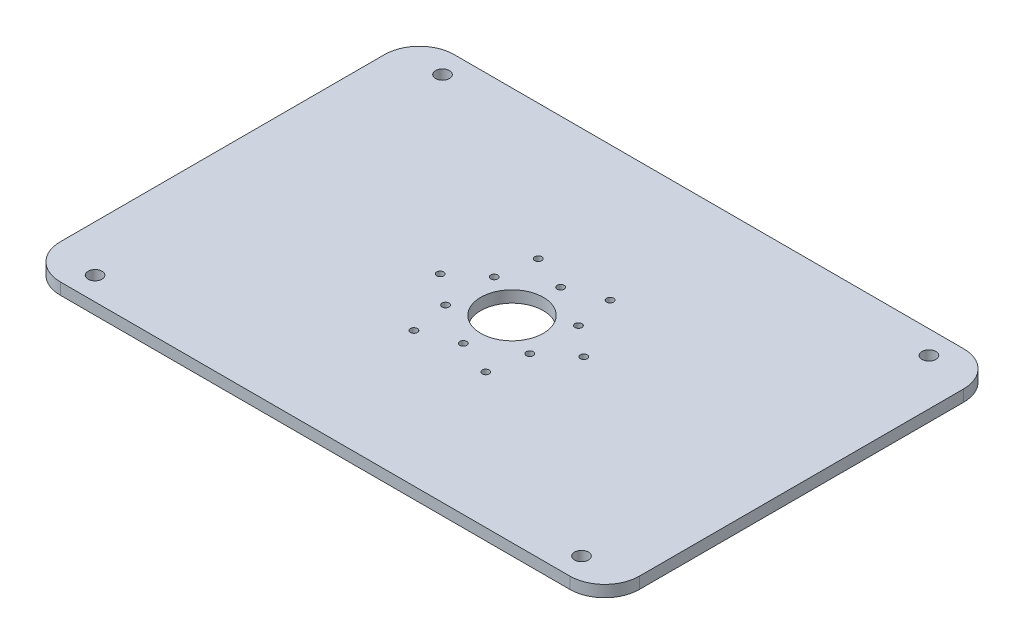
ISO-10303-21;
HEADER;
FILE_DESCRIPTION(('STEP AP214'),'2;1');
FILE_NAME('part.step','',(''),(''),'','','');
FILE_SCHEMA(('AUTOMOTIVE_DESIGN { 1 0 10303 214 1 1 1 1 }'));
ENDSEC;
DATA;
#1=APPLICATION_CONTEXT('core data for automotive mechanical design processes');
#2=APPLICATION_PROTOCOL_DEFINITION('international standard','automotive_design',2000,#1);
#3=PRODUCT_CONTEXT('',#1,'mechanical');
#4=PRODUCT('Part','Part','',(#3));
#5=PRODUCT_RELATED_PRODUCT_CATEGORY('part','',(#4));
#6=PRODUCT_DEFINITION_FORMATION('','',#4);
#7=PRODUCT_DEFINITION_CONTEXT('part definition',#1,'design');
#8=PRODUCT_DEFINITION('design','',#6,#7);
#9=PRODUCT_DEFINITION_SHAPE('','',#8);
#10=(LENGTH_UNIT() NAMED_UNIT(*) SI_UNIT(.MILLI.,.METRE.));
#11=(NAMED_UNIT(*) PLANE_ANGLE_UNIT() SI_UNIT($,.RADIAN.));
#12=(NAMED_UNIT(*) SI_UNIT($,.STERADIAN.) SOLID_ANGLE_UNIT());
#13=UNCERTAINTY_MEASURE_WITH_UNIT(LENGTH_MEASURE(1.E-05),#10,'distance_accuracy_value','');
#14=(GEOMETRIC_REPRESENTATION_CONTEXT(3) GLOBAL_UNCERTAINTY_ASSIGNED_CONTEXT((#13)) GLOBAL_UNIT_ASSIGNED_CONTEXT((#10,
#11,#12)) REPRESENTATION_CONTEXT('',''));
#15=CARTESIAN_POINT('',(0.,0.,0.));
#16=DIRECTION('',(0.,0.,1.));
#17=DIRECTION('',(1.,0.,0.));
#18=AXIS2_PLACEMENT_3D('',#15,#16,#17);
#19=CARTESIAN_POINT('',(0.,5.,0.));
#20=DIRECTION('',(0.,-1.,0.));
#21=DIRECTION('',(0.,0.,-1.));
#22=AXIS2_PLACEMENT_3D('',#19,#20,#21);
#23=PLANE('',#22);
#24=CARTESIAN_POINT('',(-18.1865334794709,5.,-10.5000000000041));
#25=DIRECTION('',(0.,1.,0.));
#26=DIRECTION('',(0.,0.,1.));
#27=AXIS2_PLACEMENT_3D('',#24,#25,#26);
#28=CIRCLE('',#27,1.49999999999574);
#29=CARTESIAN_POINT('',(-18.1865334794709,5.,-9.00000000000834));
#30=VERTEX_POINT('',#29);
#31=EDGE_CURVE('E213',#30,#30,#28,.T.);
#32=ORIENTED_EDGE('',*,*,#31,.F.);
#33=EDGE_LOOP('',(#32));
#34=FACE_BOUND('',#33,.T.);
#35=CARTESIAN_POINT('',(31.,5.,0.));
#36=DIRECTION('',(0.,1.,0.));
#37=DIRECTION('',(0.,0.,1.));
#38=AXIS2_PLACEMENT_3D('',#35,#36,#37);
#39=CIRCLE('',#38,1.5);
#40=CARTESIAN_POINT('',(31.,5.,1.5));
#41=VERTEX_POINT('',#40);
#42=EDGE_CURVE('E236',#41,#41,#39,.T.);
#43=ORIENTED_EDGE('',*,*,#42,.F.);
#44=EDGE_LOOP('',(#43));
#45=FACE_BOUND('',#44,.T.);
#46=CARTESIAN_POINT('',(1.78542417755903E-12,5.,0.));
#47=DIRECTION('',(0.,1.,0.));
#48=DIRECTION('',(0.,0.,1.));
#49=AXIS2_PLACEMENT_3D('',#46,#47,#48);
#50=CIRCLE('',#49,13.5);
#51=CARTESIAN_POINT('',(1.78542417755903E-12,5.,13.5));
#52=VERTEX_POINT('',#51);
#53=EDGE_CURVE('E237',#52,#52,#50,.T.);
#54=ORIENTED_EDGE('',*,*,#53,.F.);
#55=EDGE_LOOP('',(#54));
#56=FACE_BOUND('',#55,.T.);
#57=CARTESIAN_POINT('',(15.4999999999999,5.,26.8467875173176));
#58=DIRECTION('',(0.,1.,0.));
#59=DIRECTION('',(0.,0.,1.));
#60=AXIS2_PLACEMENT_3D('',#57,#58,#59);
#61=CIRCLE('',#60,1.5);
#62=CARTESIAN_POINT('',(15.4999999999999,5.,28.3467875173176));
#63=VERTEX_POINT('',#62);
#64=EDGE_CURVE('E248',#63,#63,#61,.T.);
#65=ORIENTED_EDGE('',*,*,#64,.F.);
#66=EDGE_LOOP('',(#65));
#67=FACE_BOUND('',#66,.T.);
#68=CARTESIAN_POINT('',(-18.1865334794751,5.,10.4999999999967));
#69=DIRECTION('',(0.,1.,0.));
#70=DIRECTION('',(0.,0.,1.));
#71=AXIS2_PLACEMENT_3D('',#68,#69,#70);
#72=CIRCLE('',#71,1.49999999999659);
#73=CARTESIAN_POINT('',(-18.1865334794751,5.,11.9999999999933));
#74=VERTEX_POINT('',#73);
#75=EDGE_CURVE('E212',#74,#74,#72,.T.);
#76=ORIENTED_EDGE('',*,*,#75,.F.);
#77=EDGE_LOOP('',(#76));
#78=FACE_BOUND('',#77,.T.);
#79=CARTESIAN_POINT('',(-1.46642216231412E-13,5.,21.));
#80=DIRECTION('',(0.,1.,0.));
#81=DIRECTION('',(0.,0.,1.));
#82=AXIS2_PLACEMENT_3D('',#79,#80,#81);
#83=CIRCLE('',#82,1.5);
#84=CARTESIAN_POINT('',(-1.46642216231412E-13,5.,22.5));
#85=VERTEX_POINT('',#84);
#86=EDGE_CURVE('E219',#85,#85,#83,.T.);
#87=ORIENTED_EDGE('',*,*,#86,.F.);
#88=EDGE_LOOP('',(#87));
#89=FACE_BOUND('',#88,.T.);
#90=CARTESIAN_POINT('',(18.1865334794732,5.,10.5000000000001));
#91=DIRECTION('',(0.,1.,0.));
#92=DIRECTION('',(0.,0.,1.));
#93=AXIS2_PLACEMENT_3D('',#90,#91,#92);
#94=CIRCLE('',#93,1.5);
#95=CARTESIAN_POINT('',(18.1865334794732,5.,12.0000000000001));
#96=VERTEX_POINT('',#95);
#97=EDGE_CURVE('E225',#96,#96,#94,.T.);
#98=ORIENTED_EDGE('',*,*,#97,.F.);
#99=EDGE_LOOP('',(#98));
#100=FACE_BOUND('',#99,.T.);
#101=CARTESIAN_POINT('',(18.1865334794732,5.,-10.5));
#102=DIRECTION('',(0.,1.,0.));
#103=DIRECTION('',(0.,0.,1.));
#104=AXIS2_PLACEMENT_3D('',#101,#102,#103);
#105=CIRCLE('',#104,1.5);
#106=CARTESIAN_POINT('',(18.1865334794732,5.,-8.99999999999996));
#107=VERTEX_POINT('',#106);
#108=EDGE_CURVE('E206',#107,#107,#105,.T.);
#109=ORIENTED_EDGE('',*,*,#108,.F.);
#110=EDGE_LOOP('',(#109));
#111=FACE_BOUND('',#110,.T.);
#112=CARTESIAN_POINT('',(-15.5000000000001,5.,26.8467875173175));
#113=DIRECTION('',(0.,1.,0.));
#114=DIRECTION('',(0.,0.,1.));
#115=AXIS2_PLACEMENT_3D('',#112,#113,#114);
#116=CIRCLE('',#115,1.5);
#117=CARTESIAN_POINT('',(-15.5000000000001,5.,28.3467875173175));
#118=VERTEX_POINT('',#117);
#119=EDGE_CURVE('E249',#118,#118,#116,.T.);
#120=ORIENTED_EDGE('',*,*,#119,.F.);
#121=EDGE_LOOP('',(#120));
#122=FACE_BOUND('',#121,.T.);
#123=CARTESIAN_POINT('',(-31.,5.,0.));
#124=DIRECTION('',(0.,1.,0.));
#125=DIRECTION('',(0.,0.,1.));
#126=AXIS2_PLACEMENT_3D('',#123,#124,#125);
#127=CIRCLE('',#126,1.49999999999994);
#128=CARTESIAN_POINT('',(-31.,5.,1.49999999999994));
#129=VERTEX_POINT('',#128);
#130=EDGE_CURVE('E272',#129,#129,#127,.T.);
#131=ORIENTED_EDGE('',*,*,#130,.F.);
#132=EDGE_LOOP('',(#131));
#133=FACE_BOUND('',#132,.T.);
#134=CARTESIAN_POINT('',(-15.4999999999997,5.,-26.8467875173177));
#135=DIRECTION('',(0.,1.,0.));
#136=DIRECTION('',(0.,0.,1.));
#137=AXIS2_PLACEMENT_3D('',#134,#135,#136);
#138=CIRCLE('',#137,1.5);
#139=CARTESIAN_POINT('',(-15.4999999999997,5.,-25.3467875173177));
#140=VERTEX_POINT('',#139);
#141=EDGE_CURVE('E266',#140,#140,#138,.T.);
#142=ORIENTED_EDGE('',*,*,#141,.F.);
#143=EDGE_LOOP('',(#142));
#144=FACE_BOUND('',#143,.T.);
#145=CARTESIAN_POINT('',(15.5000000000003,5.,-26.8467875173174));
#146=DIRECTION('',(0.,1.,0.));
#147=DIRECTION('',(0.,0.,1.));
#148=AXIS2_PLACEMENT_3D('',#145,#146,#147);
#149=CIRCLE('',#148,1.5);
#150=CARTESIAN_POINT('',(15.5000000000003,5.,-25.3467875173174));
#151=VERTEX_POINT('',#150);
#152=EDGE_CURVE('E260',#151,#151,#149,.T.);
#153=ORIENTED_EDGE('',*,*,#152,.F.);
#154=EDGE_LOOP('',(#153));
#155=FACE_BOUND('',#154,.T.);
#156=CARTESIAN_POINT('',(0.,5.,-21.));
#157=DIRECTION('',(0.,1.,0.));
#158=DIRECTION('',(0.,0.,1.));
#159=AXIS2_PLACEMENT_3D('',#156,#157,#158);
#160=CIRCLE('',#159,1.5);
#161=CARTESIAN_POINT('',(0.,5.,-19.5));
#162=VERTEX_POINT('',#161);
#163=EDGE_CURVE('E200',#162,#162,#160,.T.);
#164=ORIENTED_EDGE('',*,*,#163,.F.);
#165=EDGE_LOOP('',(#164));
#166=FACE_BOUND('',#165,.T.);
#167=DIRECTION('',(1.,0.,0.));
#168=VECTOR('',#167,1.);
#169=CARTESIAN_POINT('',(-125.,5.,85.));
#170=LINE('',#169,#168);
#171=CARTESIAN_POINT('',(-110.,5.,85.));
#172=VERTEX_POINT('',#171);
#173=CARTESIAN_POINT('',(110.,5.,85.));
#174=VERTEX_POINT('',#173);
#175=EDGE_CURVE('E138',#172,#174,#170,.T.);
#176=ORIENTED_EDGE('',*,*,#175,.T.);
#177=CARTESIAN_POINT('',(110.,5.,70.));
#178=DIRECTION('',(0.,-1.,0.));
#179=DIRECTION('',(0.,0.,-1.));
#180=AXIS2_PLACEMENT_3D('',#177,#178,#179);
#181=CIRCLE('',#180,15.);
#182=CARTESIAN_POINT('',(125.,5.,70.));
#183=VERTEX_POINT('',#182);
#184=EDGE_CURVE('E157',#174,#183,#181,.F.);
#185=ORIENTED_EDGE('',*,*,#184,.T.);
#186=DIRECTION('',(0.,0.,-1.));
#187=VECTOR('',#186,1.);
#188=CARTESIAN_POINT('',(125.,5.,85.));
#189=LINE('',#188,#187);
#190=CARTESIAN_POINT('',(125.,5.,-70.));
#191=VERTEX_POINT('',#190);
#192=EDGE_CURVE('E121',#183,#191,#189,.T.);
#193=ORIENTED_EDGE('',*,*,#192,.T.);
#194=CARTESIAN_POINT('',(110.,5.,-70.));
#195=DIRECTION('',(0.,-1.,0.));
#196=DIRECTION('',(0.,0.,-1.));
#197=AXIS2_PLACEMENT_3D('',#194,#195,#196);
#198=CIRCLE('',#197,15.);
#199=CARTESIAN_POINT('',(110.,5.,-85.));
#200=VERTEX_POINT('',#199);
#201=EDGE_CURVE('E155',#191,#200,#198,.F.);
#202=ORIENTED_EDGE('',*,*,#201,.T.);
#203=DIRECTION('',(-1.,0.,0.));
#204=VECTOR('',#203,1.);
#205=CARTESIAN_POINT('',(-125.,5.,-85.));
#206=LINE('',#205,#204);
#207=CARTESIAN_POINT('',(-110.,5.,-85.));
#208=VERTEX_POINT('',#207);
#209=EDGE_CURVE('E168',#200,#208,#206,.T.);
#210=ORIENTED_EDGE('',*,*,#209,.T.);
#211=CARTESIAN_POINT('',(-110.,5.,-70.));
#212=DIRECTION('',(0.,-1.,0.));
#213=DIRECTION('',(0.,0.,-1.));
#214=AXIS2_PLACEMENT_3D('',#211,#212,#213);
#215=CIRCLE('',#214,15.);
#216=CARTESIAN_POINT('',(-125.,5.,-70.));
#217=VERTEX_POINT('',#216);
#218=EDGE_CURVE('E56',#208,#217,#215,.F.);
#219=ORIENTED_EDGE('',*,*,#218,.T.);
#220=DIRECTION('',(0.,0.,1.));
#221=VECTOR('',#220,1.);
#222=CARTESIAN_POINT('',(-125.,5.,85.));
#223=LINE('',#222,#221);
#224=CARTESIAN_POINT('',(-125.,5.,70.));
#225=VERTEX_POINT('',#224);
#226=EDGE_CURVE('E176',#217,#225,#223,.T.);
#227=ORIENTED_EDGE('',*,*,#226,.T.);
#228=CARTESIAN_POINT('',(-110.,5.,70.));
#229=DIRECTION('',(0.,-1.,0.));
#230=DIRECTION('',(0.,0.,-1.));
#231=AXIS2_PLACEMENT_3D('',#228,#229,#230);
#232=CIRCLE('',#231,15.);
#233=EDGE_CURVE('E152',#225,#172,#232,.F.);
#234=ORIENTED_EDGE('',*,*,#233,.T.);
#235=EDGE_LOOP('',(#176,#185,#193,#202,#210,#219,#227,#234));
#236=FACE_BOUND('',#235,.T.);
#237=CARTESIAN_POINT('',(-105.,5.,-75.));
#238=DIRECTION('',(0.,1.,0.));
#239=DIRECTION('',(0.,0.,1.));
#240=AXIS2_PLACEMENT_3D('',#237,#238,#239);
#241=CIRCLE('',#240,3.00000000000001);
#242=CARTESIAN_POINT('',(-105.,5.,-72.));
#243=VERTEX_POINT('',#242);
#244=EDGE_CURVE('E129',#243,#243,#241,.T.);
#245=ORIENTED_EDGE('',*,*,#244,.F.);
#246=EDGE_LOOP('',(#245));
#247=FACE_BOUND('',#246,.T.);
#248=CARTESIAN_POINT('',(105.,5.,-75.));
#249=DIRECTION('',(0.,1.,0.));
#250=DIRECTION('',(0.,0.,1.));
#251=AXIS2_PLACEMENT_3D('',#248,#249,#250);
#252=CIRCLE('',#251,3.00000000000001);
#253=CARTESIAN_POINT('',(105.,5.,-72.));
#254=VERTEX_POINT('',#253);
#255=EDGE_CURVE('E183',#254,#254,#252,.T.);
#256=ORIENTED_EDGE('',*,*,#255,.F.);
#257=EDGE_LOOP('',(#256));
#258=FACE_BOUND('',#257,.T.);
#259=CARTESIAN_POINT('',(-105.,5.,75.));
#260=DIRECTION('',(0.,1.,0.));
#261=DIRECTION('',(0.,0.,1.));
#262=AXIS2_PLACEMENT_3D('',#259,#260,#261);
#263=CIRCLE('',#262,3.00000000000001);
#264=CARTESIAN_POINT('',(-105.,5.,78.));
#265=VERTEX_POINT('',#264);
#266=EDGE_CURVE('E188',#265,#265,#263,.T.);
#267=ORIENTED_EDGE('',*,*,#266,.F.);
#268=EDGE_LOOP('',(#267));
#269=FACE_BOUND('',#268,.T.);
#270=CARTESIAN_POINT('',(105.,5.,75.));
#271=DIRECTION('',(0.,1.,0.));
#272=DIRECTION('',(0.,0.,1.));
#273=AXIS2_PLACEMENT_3D('',#270,#271,#272);
#274=CIRCLE('',#273,3.00000000000001);
#275=CARTESIAN_POINT('',(105.,5.,78.));
#276=VERTEX_POINT('',#275);
#277=EDGE_CURVE('E194',#276,#276,#274,.T.);
#278=ORIENTED_EDGE('',*,*,#277,.F.);
#279=EDGE_LOOP('',(#278));
#280=FACE_BOUND('',#279,.T.);
#281=ADVANCED_FACE('F35',(#34,#45,#56,#67,#78,#89,#100,#111,#122,#133,#144,#155,#166,#236,#247,
#258,#269,#280),#23,.F.);
#282=CARTESIAN_POINT('',(0.,0.,0.));
#283=DIRECTION('',(0.,-1.,0.));
#284=DIRECTION('',(0.,0.,-1.));
#285=AXIS2_PLACEMENT_3D('',#282,#283,#284);
#286=PLANE('',#285);
#287=CARTESIAN_POINT('',(-18.1865334794709,0.,-10.5000000000041));
#288=DIRECTION('',(0.,1.,0.));
#289=DIRECTION('',(0.,0.,1.));
#290=AXIS2_PLACEMENT_3D('',#287,#288,#289);
#291=CIRCLE('',#290,1.49999999999574);
#292=CARTESIAN_POINT('',(-18.1865334794709,0.,-9.00000000000834));
#293=VERTEX_POINT('',#292);
#294=EDGE_CURVE('E240',#293,#293,#291,.T.);
#295=ORIENTED_EDGE('',*,*,#294,.T.);
#296=EDGE_LOOP('',(#295));
#297=FACE_BOUND('',#296,.T.);
#298=CARTESIAN_POINT('',(31.,0.,0.));
#299=DIRECTION('',(0.,1.,0.));
#300=DIRECTION('',(0.,0.,1.));
#301=AXIS2_PLACEMENT_3D('',#298,#299,#300);
#302=CIRCLE('',#301,1.5);
#303=CARTESIAN_POINT('',(31.,0.,1.5));
#304=VERTEX_POINT('',#303);
#305=EDGE_CURVE('E233',#304,#304,#302,.T.);
#306=ORIENTED_EDGE('',*,*,#305,.T.);
#307=EDGE_LOOP('',(#306));
#308=FACE_BOUND('',#307,.T.);
#309=CARTESIAN_POINT('',(1.78542417755903E-12,0.,0.));
#310=DIRECTION('',(0.,1.,0.));
#311=DIRECTION('',(0.,0.,1.));
#312=AXIS2_PLACEMENT_3D('',#309,#310,#311);
#313=CIRCLE('',#312,13.5);
#314=CARTESIAN_POINT('',(1.78542417755903E-12,0.,13.5));
#315=VERTEX_POINT('',#314);
#316=EDGE_CURVE('E252',#315,#315,#313,.T.);
#317=ORIENTED_EDGE('',*,*,#316,.T.);
#318=EDGE_LOOP('',(#317));
#319=FACE_BOUND('',#318,.T.);
#320=CARTESIAN_POINT('',(15.4999999999999,0.,26.8467875173176));
#321=DIRECTION('',(0.,1.,0.));
#322=DIRECTION('',(0.,0.,1.));
#323=AXIS2_PLACEMENT_3D('',#320,#321,#322);
#324=CIRCLE('',#323,1.5);
#325=CARTESIAN_POINT('',(15.4999999999999,0.,28.3467875173176));
#326=VERTEX_POINT('',#325);
#327=EDGE_CURVE('E245',#326,#326,#324,.T.);
#328=ORIENTED_EDGE('',*,*,#327,.T.);
#329=EDGE_LOOP('',(#328));
#330=FACE_BOUND('',#329,.T.);
#331=CARTESIAN_POINT('',(-18.1865334794751,0.,10.4999999999967));
#332=DIRECTION('',(0.,1.,0.));
#333=DIRECTION('',(0.,0.,1.));
#334=AXIS2_PLACEMENT_3D('',#331,#332,#333);
#335=CIRCLE('',#334,1.49999999999659);
#336=CARTESIAN_POINT('',(-18.1865334794751,0.,11.9999999999933));
#337=VERTEX_POINT('',#336);
#338=EDGE_CURVE('E209',#337,#337,#335,.T.);
#339=ORIENTED_EDGE('',*,*,#338,.T.);
#340=EDGE_LOOP('',(#339));
#341=FACE_BOUND('',#340,.T.);
#342=CARTESIAN_POINT('',(-1.46642216231412E-13,0.,21.));
#343=DIRECTION('',(0.,1.,0.));
#344=DIRECTION('',(0.,0.,1.));
#345=AXIS2_PLACEMENT_3D('',#342,#343,#344);
#346=CIRCLE('',#345,1.5);
#347=CARTESIAN_POINT('',(-1.46642216231412E-13,0.,22.5));
#348=VERTEX_POINT('',#347);
#349=EDGE_CURVE('E216',#348,#348,#346,.T.);
#350=ORIENTED_EDGE('',*,*,#349,.T.);
#351=EDGE_LOOP('',(#350));
#352=FACE_BOUND('',#351,.T.);
#353=CARTESIAN_POINT('',(18.1865334794732,0.,10.5000000000001));
#354=DIRECTION('',(0.,1.,0.));
#355=DIRECTION('',(0.,0.,1.));
#356=AXIS2_PLACEMENT_3D('',#353,#354,#355);
#357=CIRCLE('',#356,1.5);
#358=CARTESIAN_POINT('',(18.1865334794732,0.,12.0000000000001));
#359=VERTEX_POINT('',#358);
#360=EDGE_CURVE('E222',#359,#359,#357,.T.);
#361=ORIENTED_EDGE('',*,*,#360,.T.);
#362=EDGE_LOOP('',(#361));
#363=FACE_BOUND('',#362,.T.);
#364=CARTESIAN_POINT('',(18.1865334794732,0.,-10.5));
#365=DIRECTION('',(0.,1.,0.));
#366=DIRECTION('',(0.,0.,1.));
#367=AXIS2_PLACEMENT_3D('',#364,#365,#366);
#368=CIRCLE('',#367,1.5);
#369=CARTESIAN_POINT('',(18.1865334794732,0.,-8.99999999999996));
#370=VERTEX_POINT('',#369);
#371=EDGE_CURVE('E228',#370,#370,#368,.T.);
#372=ORIENTED_EDGE('',*,*,#371,.T.);
#373=EDGE_LOOP('',(#372));
#374=FACE_BOUND('',#373,.T.);
#375=CARTESIAN_POINT('',(-15.5000000000001,0.,26.8467875173175));
#376=DIRECTION('',(0.,1.,0.));
#377=DIRECTION('',(0.,0.,1.));
#378=AXIS2_PLACEMENT_3D('',#375,#376,#377);
#379=CIRCLE('',#378,1.5);
#380=CARTESIAN_POINT('',(-15.5000000000001,0.,28.3467875173175));
#381=VERTEX_POINT('',#380);
#382=EDGE_CURVE('E275',#381,#381,#379,.T.);
#383=ORIENTED_EDGE('',*,*,#382,.T.);
#384=EDGE_LOOP('',(#383));
#385=FACE_BOUND('',#384,.T.);
#386=CARTESIAN_POINT('',(-31.,0.,0.));
#387=DIRECTION('',(0.,1.,0.));
#388=DIRECTION('',(0.,0.,1.));
#389=AXIS2_PLACEMENT_3D('',#386,#387,#388);
#390=CIRCLE('',#389,1.49999999999994);
#391=CARTESIAN_POINT('',(-31.,0.,1.49999999999994));
#392=VERTEX_POINT('',#391);
#393=EDGE_CURVE('E269',#392,#392,#390,.T.);
#394=ORIENTED_EDGE('',*,*,#393,.T.);
#395=EDGE_LOOP('',(#394));
#396=FACE_BOUND('',#395,.T.);
#397=CARTESIAN_POINT('',(-15.4999999999997,0.,-26.8467875173177));
#398=DIRECTION('',(0.,1.,0.));
#399=DIRECTION('',(0.,0.,1.));
#400=AXIS2_PLACEMENT_3D('',#397,#398,#399);
#401=CIRCLE('',#400,1.5);
#402=CARTESIAN_POINT('',(-15.4999999999997,0.,-25.3467875173177));
#403=VERTEX_POINT('',#402);
#404=EDGE_CURVE('E263',#403,#403,#401,.T.);
#405=ORIENTED_EDGE('',*,*,#404,.T.);
#406=EDGE_LOOP('',(#405));
#407=FACE_BOUND('',#406,.T.);
#408=CARTESIAN_POINT('',(15.5000000000003,0.,-26.8467875173174));
#409=DIRECTION('',(0.,1.,0.));
#410=DIRECTION('',(0.,0.,1.));
#411=AXIS2_PLACEMENT_3D('',#408,#409,#410);
#412=CIRCLE('',#411,1.5);
#413=CARTESIAN_POINT('',(15.5000000000003,0.,-25.3467875173174));
#414=VERTEX_POINT('',#413);
#415=EDGE_CURVE('E257',#414,#414,#412,.T.);
#416=ORIENTED_EDGE('',*,*,#415,.T.);
#417=EDGE_LOOP('',(#416));
#418=FACE_BOUND('',#417,.T.);
#419=CARTESIAN_POINT('',(0.,0.,-21.));
#420=DIRECTION('',(0.,1.,0.));
#421=DIRECTION('',(0.,0.,1.));
#422=AXIS2_PLACEMENT_3D('',#419,#420,#421);
#423=CIRCLE('',#422,1.5);
#424=CARTESIAN_POINT('',(0.,0.,-19.5));
#425=VERTEX_POINT('',#424);
#426=EDGE_CURVE('E203',#425,#425,#423,.T.);
#427=ORIENTED_EDGE('',*,*,#426,.T.);
#428=EDGE_LOOP('',(#427));
#429=FACE_BOUND('',#428,.T.);
#430=CARTESIAN_POINT('',(-105.,0.,75.));
#431=DIRECTION('',(0.,1.,0.));
#432=DIRECTION('',(0.,0.,1.));
#433=AXIS2_PLACEMENT_3D('',#430,#431,#432);
#434=CIRCLE('',#433,3.00000000000001);
#435=CARTESIAN_POINT('',(-105.,0.,78.));
#436=VERTEX_POINT('',#435);
#437=EDGE_CURVE('E191',#436,#436,#434,.T.);
#438=ORIENTED_EDGE('',*,*,#437,.T.);
#439=EDGE_LOOP('',(#438));
#440=FACE_BOUND('',#439,.T.);
#441=CARTESIAN_POINT('',(-105.,0.,-75.));
#442=DIRECTION('',(0.,1.,0.));
#443=DIRECTION('',(0.,0.,1.));
#444=AXIS2_PLACEMENT_3D('',#441,#442,#443);
#445=CIRCLE('',#444,3.00000000000001);
#446=CARTESIAN_POINT('',(-105.,0.,-72.));
#447=VERTEX_POINT('',#446);
#448=EDGE_CURVE('E135',#447,#447,#445,.T.);
#449=ORIENTED_EDGE('',*,*,#448,.T.);
#450=EDGE_LOOP('',(#449));
#451=FACE_BOUND('',#450,.T.);
#452=DIRECTION('',(0.,0.,-1.));
#453=VECTOR('',#452,1.);
#454=CARTESIAN_POINT('',(125.,0.,85.));
#455=LINE('',#454,#453);
#456=CARTESIAN_POINT('',(125.,0.,70.));
#457=VERTEX_POINT('',#456);
#458=CARTESIAN_POINT('',(125.,0.,-70.));
#459=VERTEX_POINT('',#458);
#460=EDGE_CURVE('E118',#457,#459,#455,.T.);
#461=ORIENTED_EDGE('',*,*,#460,.F.);
#462=CARTESIAN_POINT('',(110.,0.,70.));
#463=DIRECTION('',(0.,-1.,0.));
#464=DIRECTION('',(0.,0.,-1.));
#465=AXIS2_PLACEMENT_3D('',#462,#463,#464);
#466=CIRCLE('',#465,15.);
#467=CARTESIAN_POINT('',(110.,0.,85.));
#468=VERTEX_POINT('',#467);
#469=EDGE_CURVE('E101',#457,#468,#466,.T.);
#470=ORIENTED_EDGE('',*,*,#469,.T.);
#471=DIRECTION('',(1.,0.,0.));
#472=VECTOR('',#471,1.);
#473=CARTESIAN_POINT('',(-125.,0.,85.));
#474=LINE('',#473,#472);
#475=CARTESIAN_POINT('',(-110.,0.,85.));
#476=VERTEX_POINT('',#475);
#477=EDGE_CURVE('E142',#476,#468,#474,.T.);
#478=ORIENTED_EDGE('',*,*,#477,.F.);
#479=CARTESIAN_POINT('',(-110.,0.,70.));
#480=DIRECTION('',(0.,-1.,0.));
#481=DIRECTION('',(0.,0.,-1.));
#482=AXIS2_PLACEMENT_3D('',#479,#480,#481);
#483=CIRCLE('',#482,15.);
#484=CARTESIAN_POINT('',(-125.,0.,70.));
#485=VERTEX_POINT('',#484);
#486=EDGE_CURVE('E122',#476,#485,#483,.T.);
#487=ORIENTED_EDGE('',*,*,#486,.T.);
#488=DIRECTION('',(0.,0.,1.));
#489=VECTOR('',#488,1.);
#490=CARTESIAN_POINT('',(-125.,0.,85.));
#491=LINE('',#490,#489);
#492=CARTESIAN_POINT('',(-125.,0.,-70.));
#493=VERTEX_POINT('',#492);
#494=EDGE_CURVE('E132',#493,#485,#491,.T.);
#495=ORIENTED_EDGE('',*,*,#494,.F.);
#496=CARTESIAN_POINT('',(-110.,0.,-70.));
#497=DIRECTION('',(0.,-1.,0.));
#498=DIRECTION('',(0.,0.,-1.));
#499=AXIS2_PLACEMENT_3D('',#496,#497,#498);
#500=CIRCLE('',#499,15.);
#501=CARTESIAN_POINT('',(-110.,0.,-85.));
#502=VERTEX_POINT('',#501);
#503=EDGE_CURVE('E146',#493,#502,#500,.T.);
#504=ORIENTED_EDGE('',*,*,#503,.T.);
#505=DIRECTION('',(-1.,0.,0.));
#506=VECTOR('',#505,1.);
#507=CARTESIAN_POINT('',(-125.,0.,-85.));
#508=LINE('',#507,#506);
#509=CARTESIAN_POINT('',(110.,0.,-85.));
#510=VERTEX_POINT('',#509);
#511=EDGE_CURVE('E128',#510,#502,#508,.T.);
#512=ORIENTED_EDGE('',*,*,#511,.F.);
#513=CARTESIAN_POINT('',(110.,0.,-70.));
#514=DIRECTION('',(0.,-1.,0.));
#515=DIRECTION('',(0.,0.,-1.));
#516=AXIS2_PLACEMENT_3D('',#513,#514,#515);
#517=CIRCLE('',#516,15.);
#518=EDGE_CURVE('E112',#510,#459,#517,.T.);
#519=ORIENTED_EDGE('',*,*,#518,.T.);
#520=EDGE_LOOP('',(#461,#470,#478,#487,#495,#504,#512,#519));
#521=FACE_BOUND('',#520,.T.);
#522=CARTESIAN_POINT('',(105.,0.,-75.));
#523=DIRECTION('',(0.,1.,0.));
#524=DIRECTION('',(0.,0.,1.));
#525=AXIS2_PLACEMENT_3D('',#522,#523,#524);
#526=CIRCLE('',#525,3.00000000000001);
#527=CARTESIAN_POINT('',(105.,0.,-72.));
#528=VERTEX_POINT('',#527);
#529=EDGE_CURVE('E185',#528,#528,#526,.T.);
#530=ORIENTED_EDGE('',*,*,#529,.T.);
#531=EDGE_LOOP('',(#530));
#532=FACE_BOUND('',#531,.T.);
#533=CARTESIAN_POINT('',(105.,0.,75.));
#534=DIRECTION('',(0.,1.,0.));
#535=DIRECTION('',(0.,0.,1.));
#536=AXIS2_PLACEMENT_3D('',#533,#534,#535);
#537=CIRCLE('',#536,3.00000000000001);
#538=CARTESIAN_POINT('',(105.,0.,78.));
#539=VERTEX_POINT('',#538);
#540=EDGE_CURVE('E197',#539,#539,#537,.T.);
#541=ORIENTED_EDGE('',*,*,#540,.T.);
#542=EDGE_LOOP('',(#541));
#543=FACE_BOUND('',#542,.T.);
#544=ADVANCED_FACE('F125',(#297,#308,#319,#330,#341,#352,#363,#374,#385,#396,#407,#418,#429,
#440,#451,#521,#532,#543),#286,.T.);
#545=CARTESIAN_POINT('',(125.,5.,85.));
#546=DIRECTION('',(-1.,0.,0.));
#547=DIRECTION('',(0.,0.,1.));
#548=AXIS2_PLACEMENT_3D('',#545,#546,#547);
#549=PLANE('',#548);
#550=ORIENTED_EDGE('',*,*,#192,.F.);
#551=DIRECTION('',(0.,-1.,0.));
#552=VECTOR('',#551,1.);
#553=CARTESIAN_POINT('',(125.,5.,70.));
#554=LINE('',#553,#552);
#555=EDGE_CURVE('E105',#183,#457,#554,.T.);
#556=ORIENTED_EDGE('',*,*,#555,.T.);
#557=ORIENTED_EDGE('',*,*,#460,.T.);
#558=DIRECTION('',(0.,-1.,0.));
#559=VECTOR('',#558,1.);
#560=CARTESIAN_POINT('',(125.,5.,-70.));
#561=LINE('',#560,#559);
#562=EDGE_CURVE('E123',#459,#191,#561,.F.);
#563=ORIENTED_EDGE('',*,*,#562,.T.);
#564=EDGE_LOOP('',(#550,#556,#557,#563));
#565=FACE_BOUND('',#564,.T.);
#566=ADVANCED_FACE('F117',(#565),#549,.F.);
#567=CARTESIAN_POINT('',(-125.,5.,-85.));
#568=DIRECTION('',(0.,0.,1.));
#569=DIRECTION('',(1.,0.,0.));
#570=AXIS2_PLACEMENT_3D('',#567,#568,#569);
#571=PLANE('',#570);
#572=ORIENTED_EDGE('',*,*,#209,.F.);
#573=DIRECTION('',(0.,-1.,0.));
#574=VECTOR('',#573,1.);
#575=CARTESIAN_POINT('',(110.,5.,-85.));
#576=LINE('',#575,#574);
#577=EDGE_CURVE('E161',#200,#510,#576,.T.);
#578=ORIENTED_EDGE('',*,*,#577,.T.);
#579=ORIENTED_EDGE('',*,*,#511,.T.);
#580=DIRECTION('',(0.,-1.,0.));
#581=VECTOR('',#580,1.);
#582=CARTESIAN_POINT('',(-110.,5.,-85.));
#583=LINE('',#582,#581);
#584=EDGE_CURVE('E159',#502,#208,#583,.F.);
#585=ORIENTED_EDGE('',*,*,#584,.T.);
#586=EDGE_LOOP('',(#572,#578,#579,#585));
#587=FACE_BOUND('',#586,.T.);
#588=ADVANCED_FACE('F166',(#587),#571,.F.);
#589=CARTESIAN_POINT('',(-125.,5.,85.));
#590=DIRECTION('',(1.,0.,0.));
#591=DIRECTION('',(0.,0.,-1.));
#592=AXIS2_PLACEMENT_3D('',#589,#590,#591);
#593=PLANE('',#592);
#594=ORIENTED_EDGE('',*,*,#226,.F.);
#595=DIRECTION('',(0.,-1.,0.));
#596=VECTOR('',#595,1.);
#597=CARTESIAN_POINT('',(-125.,5.,-70.));
#598=LINE('',#597,#596);
#599=EDGE_CURVE('E11',#217,#493,#598,.T.);
#600=ORIENTED_EDGE('',*,*,#599,.T.);
#601=ORIENTED_EDGE('',*,*,#494,.T.);
#602=DIRECTION('',(0.,-1.,0.));
#603=VECTOR('',#602,1.);
#604=CARTESIAN_POINT('',(-125.,5.,70.));
#605=LINE('',#604,#603);
#606=EDGE_CURVE('E43',#485,#225,#605,.F.);
#607=ORIENTED_EDGE('',*,*,#606,.T.);
#608=EDGE_LOOP('',(#594,#600,#601,#607));
#609=FACE_BOUND('',#608,.T.);
#610=ADVANCED_FACE('F175',(#609),#593,.F.);
#611=CARTESIAN_POINT('',(-125.,5.,85.));
#612=DIRECTION('',(0.,0.,-1.));
#613=DIRECTION('',(-1.,0.,0.));
#614=AXIS2_PLACEMENT_3D('',#611,#612,#613);
#615=PLANE('',#614);
#616=ORIENTED_EDGE('',*,*,#477,.T.);
#617=DIRECTION('',(0.,-1.,0.));
#618=VECTOR('',#617,1.);
#619=CARTESIAN_POINT('',(110.,5.,85.));
#620=LINE('',#619,#618);
#621=EDGE_CURVE('E106',#468,#174,#620,.F.);
#622=ORIENTED_EDGE('',*,*,#621,.T.);
#623=ORIENTED_EDGE('',*,*,#175,.F.);
#624=DIRECTION('',(0.,-1.,0.));
#625=VECTOR('',#624,1.);
#626=CARTESIAN_POINT('',(-110.,5.,85.));
#627=LINE('',#626,#625);
#628=EDGE_CURVE('E111',#172,#476,#627,.T.);
#629=ORIENTED_EDGE('',*,*,#628,.T.);
#630=EDGE_LOOP('',(#616,#622,#623,#629));
#631=FACE_BOUND('',#630,.T.);
#632=ADVANCED_FACE('F322',(#631),#615,.F.);
#633=CARTESIAN_POINT('',(-105.,5.,-75.));
#634=DIRECTION('',(0.,-1.,0.));
#635=DIRECTION('',(0.,0.,-1.));
#636=AXIS2_PLACEMENT_3D('',#633,#634,#635);
#637=CYLINDRICAL_SURFACE('',#636,3.00000000000001);
#638=ORIENTED_EDGE('',*,*,#244,.T.);
#639=EDGE_LOOP('',(#638));
#640=FACE_BOUND('',#639,.T.);
#641=ORIENTED_EDGE('',*,*,#448,.F.);
#642=EDGE_LOOP('',(#641));
#643=FACE_BOUND('',#642,.T.);
#644=ADVANCED_FACE('F325',(#640,#643),#637,.F.);
#645=CARTESIAN_POINT('',(105.,5.,-75.));
#646=DIRECTION('',(0.,-1.,0.));
#647=DIRECTION('',(0.,0.,-1.));
#648=AXIS2_PLACEMENT_3D('',#645,#646,#647);
#649=CYLINDRICAL_SURFACE('',#648,3.00000000000001);
#650=ORIENTED_EDGE('',*,*,#255,.T.);
#651=EDGE_LOOP('',(#650));
#652=FACE_BOUND('',#651,.T.);
#653=ORIENTED_EDGE('',*,*,#529,.F.);
#654=EDGE_LOOP('',(#653));
#655=FACE_BOUND('',#654,.T.);
#656=ADVANCED_FACE('F361',(#652,#655),#649,.F.);
#657=CARTESIAN_POINT('',(-105.,5.,75.));
#658=DIRECTION('',(0.,-1.,0.));
#659=DIRECTION('',(0.,0.,-1.));
#660=AXIS2_PLACEMENT_3D('',#657,#658,#659);
#661=CYLINDRICAL_SURFACE('',#660,3.00000000000001);
#662=ORIENTED_EDGE('',*,*,#266,.T.);
#663=EDGE_LOOP('',(#662));
#664=FACE_BOUND('',#663,.T.);
#665=ORIENTED_EDGE('',*,*,#437,.F.);
#666=EDGE_LOOP('',(#665));
#667=FACE_BOUND('',#666,.T.);
#668=ADVANCED_FACE('F308',(#664,#667),#661,.F.);
#669=CARTESIAN_POINT('',(105.,5.,75.));
#670=DIRECTION('',(0.,-1.,0.));
#671=DIRECTION('',(0.,0.,-1.));
#672=AXIS2_PLACEMENT_3D('',#669,#670,#671);
#673=CYLINDRICAL_SURFACE('',#672,3.00000000000001);
#674=ORIENTED_EDGE('',*,*,#277,.T.);
#675=EDGE_LOOP('',(#674));
#676=FACE_BOUND('',#675,.T.);
#677=ORIENTED_EDGE('',*,*,#540,.F.);
#678=EDGE_LOOP('',(#677));
#679=FACE_BOUND('',#678,.T.);
#680=ADVANCED_FACE('F305',(#676,#679),#673,.F.);
#681=CARTESIAN_POINT('',(110.,5.,70.));
#682=DIRECTION('',(0.,-1.,0.));
#683=DIRECTION('',(0.,0.,-1.));
#684=AXIS2_PLACEMENT_3D('',#681,#682,#683);
#685=CYLINDRICAL_SURFACE('',#684,15.);
#686=ORIENTED_EDGE('',*,*,#184,.F.);
#687=ORIENTED_EDGE('',*,*,#621,.F.);
#688=ORIENTED_EDGE('',*,*,#469,.F.);
#689=ORIENTED_EDGE('',*,*,#555,.F.);
#690=EDGE_LOOP('',(#686,#687,#688,#689));
#691=FACE_BOUND('',#690,.T.);
#692=ADVANCED_FACE('F104',(#691),#685,.T.);
#693=CARTESIAN_POINT('',(110.,5.,-70.));
#694=DIRECTION('',(0.,-1.,0.));
#695=DIRECTION('',(0.,0.,-1.));
#696=AXIS2_PLACEMENT_3D('',#693,#694,#695);
#697=CYLINDRICAL_SURFACE('',#696,15.);
#698=ORIENTED_EDGE('',*,*,#201,.F.);
#699=ORIENTED_EDGE('',*,*,#562,.F.);
#700=ORIENTED_EDGE('',*,*,#518,.F.);
#701=ORIENTED_EDGE('',*,*,#577,.F.);
#702=EDGE_LOOP('',(#698,#699,#700,#701));
#703=FACE_BOUND('',#702,.T.);
#704=ADVANCED_FACE('F333',(#703),#697,.T.);
#705=CARTESIAN_POINT('',(-110.,5.,-70.));
#706=DIRECTION('',(0.,-1.,0.));
#707=DIRECTION('',(0.,0.,-1.));
#708=AXIS2_PLACEMENT_3D('',#705,#706,#707);
#709=CYLINDRICAL_SURFACE('',#708,15.);
#710=ORIENTED_EDGE('',*,*,#218,.F.);
#711=ORIENTED_EDGE('',*,*,#584,.F.);
#712=ORIENTED_EDGE('',*,*,#503,.F.);
#713=ORIENTED_EDGE('',*,*,#599,.F.);
#714=EDGE_LOOP('',(#710,#711,#712,#713));
#715=FACE_BOUND('',#714,.T.);
#716=ADVANCED_FACE('F174',(#715),#709,.T.);
#717=CARTESIAN_POINT('',(-110.,5.,70.));
#718=DIRECTION('',(0.,-1.,0.));
#719=DIRECTION('',(0.,0.,-1.));
#720=AXIS2_PLACEMENT_3D('',#717,#718,#719);
#721=CYLINDRICAL_SURFACE('',#720,15.);
#722=ORIENTED_EDGE('',*,*,#233,.F.);
#723=ORIENTED_EDGE('',*,*,#606,.F.);
#724=ORIENTED_EDGE('',*,*,#486,.F.);
#725=ORIENTED_EDGE('',*,*,#628,.F.);
#726=EDGE_LOOP('',(#722,#723,#724,#725));
#727=FACE_BOUND('',#726,.T.);
#728=ADVANCED_FACE('F37',(#727),#721,.T.);
#729=CARTESIAN_POINT('',(0.,5.,-21.));
#730=DIRECTION('',(0.,-1.,0.));
#731=DIRECTION('',(0.,0.,-1.));
#732=AXIS2_PLACEMENT_3D('',#729,#730,#731);
#733=CYLINDRICAL_SURFACE('',#732,1.5);
#734=ORIENTED_EDGE('',*,*,#163,.T.);
#735=EDGE_LOOP('',(#734));
#736=FACE_BOUND('',#735,.T.);
#737=ORIENTED_EDGE('',*,*,#426,.F.);
#738=EDGE_LOOP('',(#737));
#739=FACE_BOUND('',#738,.T.);
#740=ADVANCED_FACE('F339',(#736,#739),#733,.F.);
#741=CARTESIAN_POINT('',(15.5000000000003,5.,-26.8467875173174));
#742=DIRECTION('',(0.,-1.,0.));
#743=DIRECTION('',(0.,0.,-1.));
#744=AXIS2_PLACEMENT_3D('',#741,#742,#743);
#745=CYLINDRICAL_SURFACE('',#744,1.5);
#746=ORIENTED_EDGE('',*,*,#152,.T.);
#747=EDGE_LOOP('',(#746));
#748=FACE_BOUND('',#747,.T.);
#749=ORIENTED_EDGE('',*,*,#415,.F.);
#750=EDGE_LOOP('',(#749));
#751=FACE_BOUND('',#750,.T.);
#752=ADVANCED_FACE('F344',(#748,#751),#745,.F.);
#753=CARTESIAN_POINT('',(-15.4999999999997,5.,-26.8467875173177));
#754=DIRECTION('',(0.,-1.,0.));
#755=DIRECTION('',(0.,0.,-1.));
#756=AXIS2_PLACEMENT_3D('',#753,#754,#755);
#757=CYLINDRICAL_SURFACE('',#756,1.5);
#758=ORIENTED_EDGE('',*,*,#141,.T.);
#759=EDGE_LOOP('',(#758));
#760=FACE_BOUND('',#759,.T.);
#761=ORIENTED_EDGE('',*,*,#404,.F.);
#762=EDGE_LOOP('',(#761));
#763=FACE_BOUND('',#762,.T.);
#764=ADVANCED_FACE('F351',(#760,#763),#757,.F.);
#765=CARTESIAN_POINT('',(-31.,5.,0.));
#766=DIRECTION('',(0.,-1.,0.));
#767=DIRECTION('',(0.,0.,-1.));
#768=AXIS2_PLACEMENT_3D('',#765,#766,#767);
#769=CYLINDRICAL_SURFACE('',#768,1.49999999999994);
#770=ORIENTED_EDGE('',*,*,#130,.T.);
#771=EDGE_LOOP('',(#770));
#772=FACE_BOUND('',#771,.T.);
#773=ORIENTED_EDGE('',*,*,#393,.F.);
#774=EDGE_LOOP('',(#773));
#775=FACE_BOUND('',#774,.T.);
#776=ADVANCED_FACE('F433',(#772,#775),#769,.F.);
#777=CARTESIAN_POINT('',(-15.5000000000001,5.,26.8467875173175));
#778=DIRECTION('',(0.,-1.,0.));
#779=DIRECTION('',(0.,0.,-1.));
#780=AXIS2_PLACEMENT_3D('',#777,#778,#779);
#781=CYLINDRICAL_SURFACE('',#780,1.5);
#782=ORIENTED_EDGE('',*,*,#119,.T.);
#783=EDGE_LOOP('',(#782));
#784=FACE_BOUND('',#783,.T.);
#785=ORIENTED_EDGE('',*,*,#382,.F.);
#786=EDGE_LOOP('',(#785));
#787=FACE_BOUND('',#786,.T.);
#788=ADVANCED_FACE('F281',(#784,#787),#781,.F.);
#789=CARTESIAN_POINT('',(18.1865334794732,5.,-10.5));
#790=DIRECTION('',(0.,-1.,0.));
#791=DIRECTION('',(0.,0.,-1.));
#792=AXIS2_PLACEMENT_3D('',#789,#790,#791);
#793=CYLINDRICAL_SURFACE('',#792,1.5);
#794=ORIENTED_EDGE('',*,*,#108,.T.);
#795=EDGE_LOOP('',(#794));
#796=FACE_BOUND('',#795,.T.);
#797=ORIENTED_EDGE('',*,*,#371,.F.);
#798=EDGE_LOOP('',(#797));
#799=FACE_BOUND('',#798,.T.);
#800=ADVANCED_FACE('F452',(#796,#799),#793,.F.);
#801=CARTESIAN_POINT('',(18.1865334794732,5.,10.5000000000001));
#802=DIRECTION('',(0.,-1.,0.));
#803=DIRECTION('',(0.,0.,-1.));
#804=AXIS2_PLACEMENT_3D('',#801,#802,#803);
#805=CYLINDRICAL_SURFACE('',#804,1.5);
#806=ORIENTED_EDGE('',*,*,#97,.T.);
#807=EDGE_LOOP('',(#806));
#808=FACE_BOUND('',#807,.T.);
#809=ORIENTED_EDGE('',*,*,#360,.F.);
#810=EDGE_LOOP('',(#809));
#811=FACE_BOUND('',#810,.T.);
#812=ADVANCED_FACE('F461',(#808,#811),#805,.F.);
#813=CARTESIAN_POINT('',(-1.46642216231412E-13,5.,21.));
#814=DIRECTION('',(0.,-1.,0.));
#815=DIRECTION('',(0.,0.,-1.));
#816=AXIS2_PLACEMENT_3D('',#813,#814,#815);
#817=CYLINDRICAL_SURFACE('',#816,1.5);
#818=ORIENTED_EDGE('',*,*,#86,.T.);
#819=EDGE_LOOP('',(#818));
#820=FACE_BOUND('',#819,.T.);
#821=ORIENTED_EDGE('',*,*,#349,.F.);
#822=EDGE_LOOP('',(#821));
#823=FACE_BOUND('',#822,.T.);
#824=ADVANCED_FACE('F471',(#820,#823),#817,.F.);
#825=CARTESIAN_POINT('',(-18.1865334794751,5.,10.4999999999967));
#826=DIRECTION('',(0.,-1.,0.));
#827=DIRECTION('',(0.,0.,-1.));
#828=AXIS2_PLACEMENT_3D('',#825,#826,#827);
#829=CYLINDRICAL_SURFACE('',#828,1.49999999999659);
#830=ORIENTED_EDGE('',*,*,#75,.T.);
#831=EDGE_LOOP('',(#830));
#832=FACE_BOUND('',#831,.T.);
#833=ORIENTED_EDGE('',*,*,#338,.F.);
#834=EDGE_LOOP('',(#833));
#835=FACE_BOUND('',#834,.T.);
#836=ADVANCED_FACE('F356',(#832,#835),#829,.F.);
#837=CARTESIAN_POINT('',(15.4999999999999,5.,26.8467875173176));
#838=DIRECTION('',(0.,-1.,0.));
#839=DIRECTION('',(0.,0.,-1.));
#840=AXIS2_PLACEMENT_3D('',#837,#838,#839);
#841=CYLINDRICAL_SURFACE('',#840,1.5);
#842=ORIENTED_EDGE('',*,*,#64,.T.);
#843=EDGE_LOOP('',(#842));
#844=FACE_BOUND('',#843,.T.);
#845=ORIENTED_EDGE('',*,*,#327,.F.);
#846=EDGE_LOOP('',(#845));
#847=FACE_BOUND('',#846,.T.);
#848=ADVANCED_FACE('F489',(#844,#847),#841,.F.);
#849=CARTESIAN_POINT('',(1.78542417755903E-12,5.,0.));
#850=DIRECTION('',(0.,-1.,0.));
#851=DIRECTION('',(0.,0.,-1.));
#852=AXIS2_PLACEMENT_3D('',#849,#850,#851);
#853=CYLINDRICAL_SURFACE('',#852,13.5);
#854=ORIENTED_EDGE('',*,*,#53,.T.);
#855=EDGE_LOOP('',(#854));
#856=FACE_BOUND('',#855,.T.);
#857=ORIENTED_EDGE('',*,*,#316,.F.);
#858=EDGE_LOOP('',(#857));
#859=FACE_BOUND('',#858,.T.);
#860=ADVANCED_FACE('F498',(#856,#859),#853,.F.);
#861=CARTESIAN_POINT('',(31.,5.,0.));
#862=DIRECTION('',(0.,-1.,0.));
#863=DIRECTION('',(0.,0.,-1.));
#864=AXIS2_PLACEMENT_3D('',#861,#862,#863);
#865=CYLINDRICAL_SURFACE('',#864,1.5);
#866=ORIENTED_EDGE('',*,*,#42,.T.);
#867=EDGE_LOOP('',(#866));
#868=FACE_BOUND('',#867,.T.);
#869=ORIENTED_EDGE('',*,*,#305,.F.);
#870=EDGE_LOOP('',(#869));
#871=FACE_BOUND('',#870,.T.);
#872=ADVANCED_FACE('F508',(#868,#871),#865,.F.);
#873=CARTESIAN_POINT('',(-18.1865334794709,5.,-10.5000000000041));
#874=DIRECTION('',(0.,-1.,0.));
#875=DIRECTION('',(0.,0.,-1.));
#876=AXIS2_PLACEMENT_3D('',#873,#874,#875);
#877=CYLINDRICAL_SURFACE('',#876,1.49999999999574);
#878=ORIENTED_EDGE('',*,*,#31,.T.);
#879=EDGE_LOOP('',(#878));
#880=FACE_BOUND('',#879,.T.);
#881=ORIENTED_EDGE('',*,*,#294,.F.);
#882=EDGE_LOOP('',(#881));
#883=FACE_BOUND('',#882,.T.);
#884=ADVANCED_FACE('F518',(#880,#883),#877,.F.);
#885=CLOSED_SHELL('',(#281,#544,#566,#588,#610,#632,#644,#656,#668,#680,#692,#704,#716,#728,
#740,#752,#764,#776,#788,#800,#812,#824,#836,#848,#860,#872,#884));
#886=MANIFOLD_SOLID_BREP('B2',#885);
#887=ADVANCED_BREP_SHAPE_REPRESENTATION('',(#18,#886),#14);
#888=SHAPE_DEFINITION_REPRESENTATION(#9,#887);
ENDSEC;
END-ISO-10303-21;
